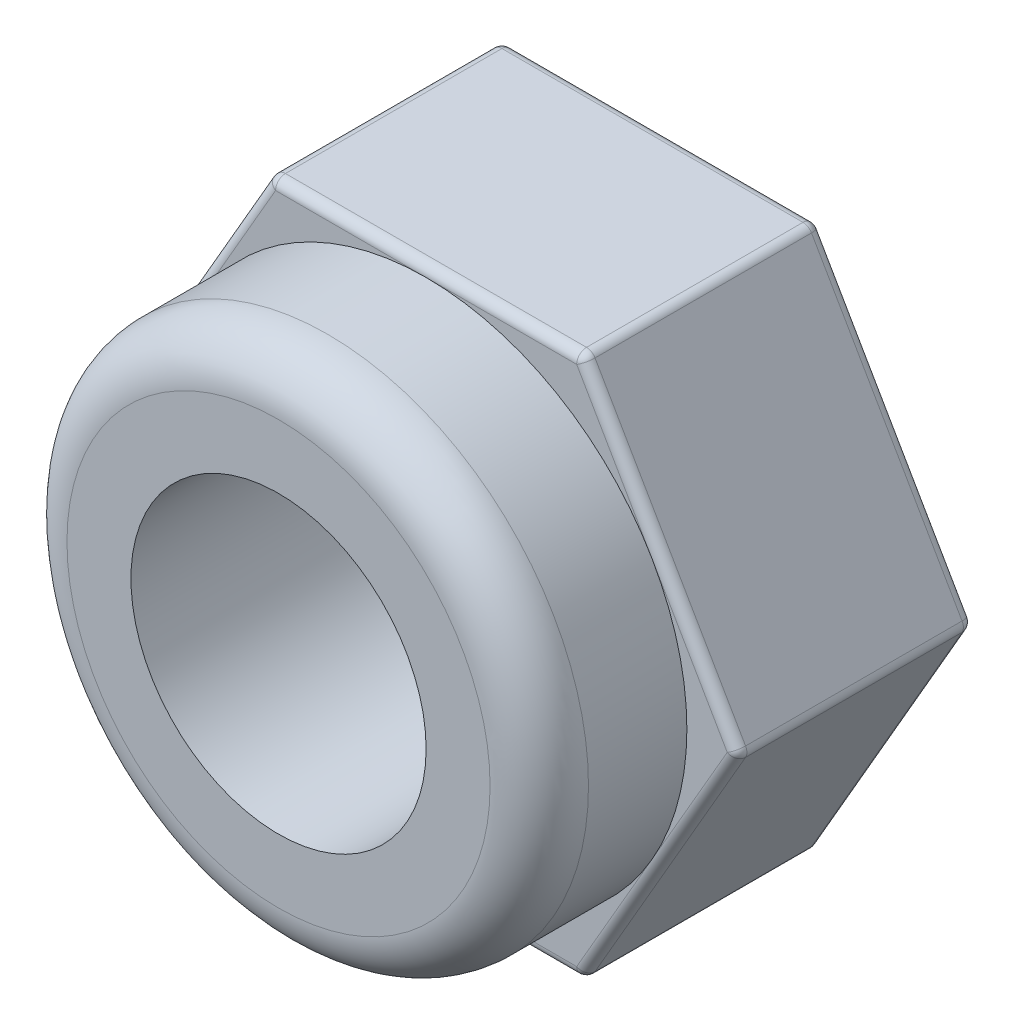
ISO-10303-21;
HEADER;
FILE_DESCRIPTION(('STEP AP214'),'2;1');
FILE_NAME('part.step','',(''),(''),'','','');
FILE_SCHEMA(('AUTOMOTIVE_DESIGN { 1 0 10303 214 1 1 1 1 }'));
ENDSEC;
DATA;
#1=APPLICATION_CONTEXT('core data for automotive mechanical design processes');
#2=APPLICATION_PROTOCOL_DEFINITION('international standard','automotive_design',2000,#1);
#3=PRODUCT_CONTEXT('',#1,'mechanical');
#4=PRODUCT('Part','Part','',(#3));
#5=PRODUCT_RELATED_PRODUCT_CATEGORY('part','',(#4));
#6=PRODUCT_DEFINITION_FORMATION('','',#4);
#7=PRODUCT_DEFINITION_CONTEXT('part definition',#1,'design');
#8=PRODUCT_DEFINITION('design','',#6,#7);
#9=PRODUCT_DEFINITION_SHAPE('','',#8);
#10=(LENGTH_UNIT() NAMED_UNIT(*) SI_UNIT(.MILLI.,.METRE.));
#11=(NAMED_UNIT(*) PLANE_ANGLE_UNIT() SI_UNIT($,.RADIAN.));
#12=(NAMED_UNIT(*) SI_UNIT($,.STERADIAN.) SOLID_ANGLE_UNIT());
#13=UNCERTAINTY_MEASURE_WITH_UNIT(LENGTH_MEASURE(1.E-05),#10,'distance_accuracy_value','');
#14=(GEOMETRIC_REPRESENTATION_CONTEXT(3) GLOBAL_UNCERTAINTY_ASSIGNED_CONTEXT((#13)) GLOBAL_UNIT_ASSIGNED_CONTEXT((#10,
#11,#12)) REPRESENTATION_CONTEXT('',''));
#15=CARTESIAN_POINT('',(0.,0.,0.));
#16=DIRECTION('',(0.,0.,1.));
#17=DIRECTION('',(1.,0.,0.));
#18=AXIS2_PLACEMENT_3D('',#15,#16,#17);
#19=CARTESIAN_POINT('',(0.,0.,2.4));
#20=DIRECTION('',(0.,0.,1.));
#21=DIRECTION('',(1.,0.,0.));
#22=AXIS2_PLACEMENT_3D('',#19,#20,#21);
#23=PLANE('',#22);
#24=DIRECTION('',(0.5,-0.866025403784439,0.));
#25=VECTOR('',#24,1.);
#26=CARTESIAN_POINT('',(-1.50111069989303,-2.7,2.4));
#27=LINE('',#26,#25);
#28=CARTESIAN_POINT('',(-2.29496732002876,-1.325,2.4));
#29=VERTEX_POINT('',#28);
#30=CARTESIAN_POINT('',(-1.52997821335251,-2.65,2.4));
#31=VERTEX_POINT('',#30);
#32=EDGE_CURVE('E189',#29,#31,#27,.T.);
#33=ORIENTED_EDGE('',*,*,#32,.T.);
#34=DIRECTION('',(1.,0.,0.));
#35=VECTOR('',#34,1.);
#36=CARTESIAN_POINT('',(1.58771324027147,-2.65,2.4));
#37=LINE('',#36,#35);
#38=CARTESIAN_POINT('',(0.,-2.65,2.4));
#39=VERTEX_POINT('',#38);
#40=EDGE_CURVE('E224',#31,#39,#37,.T.);
#41=ORIENTED_EDGE('',*,*,#40,.T.);
#42=CARTESIAN_POINT('',(0.,0.,2.4));
#43=DIRECTION('',(0.,0.,1.));
#44=DIRECTION('',(1.,0.,0.));
#45=AXIS2_PLACEMENT_3D('',#42,#43,#44);
#46=CIRCLE('',#45,2.65);
#47=EDGE_CURVE('E209',#39,#29,#46,.F.);
#48=ORIENTED_EDGE('',*,*,#47,.T.);
#49=EDGE_LOOP('',(#33,#41,#48));
#50=FACE_BOUND('',#49,.T.);
#51=ADVANCED_FACE('F36',(#50),#23,.T.);
#52=CARTESIAN_POINT('',(2.29496732002876,-1.325,2.4));
#53=VERTEX_POINT('',#52);
#54=EDGE_CURVE('E183',#53,#39,#46,.F.);
#55=ORIENTED_EDGE('',*,*,#54,.T.);
#56=DIRECTION('',(1.,0.,0.));
#57=VECTOR('',#56,1.);
#58=CARTESIAN_POINT('',(1.58771324027147,-2.65,2.4));
#59=LINE('',#58,#57);
#60=CARTESIAN_POINT('',(1.52997821335251,-2.65,2.4));
#61=VERTEX_POINT('',#60);
#62=EDGE_CURVE('E185',#39,#61,#59,.T.);
#63=ORIENTED_EDGE('',*,*,#62,.T.);
#64=DIRECTION('',(0.5,0.866025403784439,0.));
#65=VECTOR('',#64,1.);
#66=CARTESIAN_POINT('',(3.0888239401645,0.0500000000000003,2.4));
#67=LINE('',#66,#65);
#68=EDGE_CURVE('E179',#61,#53,#67,.T.);
#69=ORIENTED_EDGE('',*,*,#68,.T.);
#70=EDGE_LOOP('',(#55,#63,#69));
#71=FACE_BOUND('',#70,.T.);
#72=ADVANCED_FACE('F181',(#71),#23,.T.);
#73=CARTESIAN_POINT('',(2.29496732002876,1.325,2.4));
#74=VERTEX_POINT('',#73);
#75=EDGE_CURVE('E195',#74,#53,#46,.F.);
#76=ORIENTED_EDGE('',*,*,#75,.T.);
#77=DIRECTION('',(0.5,0.866025403784439,0.));
#78=VECTOR('',#77,1.);
#79=CARTESIAN_POINT('',(3.0888239401645,0.0500000000000003,2.4));
#80=LINE('',#79,#78);
#81=CARTESIAN_POINT('',(3.05995642670502,0.,2.4));
#82=VERTEX_POINT('',#81);
#83=EDGE_CURVE('E190',#53,#82,#80,.T.);
#84=ORIENTED_EDGE('',*,*,#83,.T.);
#85=DIRECTION('',(-0.5,0.866025403784439,0.));
#86=VECTOR('',#85,1.);
#87=CARTESIAN_POINT('',(1.50111069989303,2.7,2.4));
#88=LINE('',#87,#86);
#89=EDGE_CURVE('E199',#82,#74,#88,.T.);
#90=ORIENTED_EDGE('',*,*,#89,.T.);
#91=EDGE_LOOP('',(#76,#84,#90));
#92=FACE_BOUND('',#91,.T.);
#93=ADVANCED_FACE('F196',(#92),#23,.T.);
#94=DIRECTION('',(-0.5,-0.866025403784439,0.));
#95=VECTOR('',#94,1.);
#96=CARTESIAN_POINT('',(-3.0888239401645,-0.0499999999999999,2.4));
#97=LINE('',#96,#95);
#98=CARTESIAN_POINT('',(-2.29496732002876,1.325,2.4));
#99=VERTEX_POINT('',#98);
#100=CARTESIAN_POINT('',(-3.05995642670502,0.,2.4));
#101=VERTEX_POINT('',#100);
#102=EDGE_CURVE('E218',#99,#101,#97,.T.);
#103=ORIENTED_EDGE('',*,*,#102,.T.);
#104=DIRECTION('',(0.5,-0.866025403784439,0.));
#105=VECTOR('',#104,1.);
#106=CARTESIAN_POINT('',(-1.50111069989303,-2.7,2.4));
#107=LINE('',#106,#105);
#108=EDGE_CURVE('E216',#101,#29,#107,.T.);
#109=ORIENTED_EDGE('',*,*,#108,.T.);
#110=EDGE_CURVE('E506',#29,#99,#46,.F.);
#111=ORIENTED_EDGE('',*,*,#110,.T.);
#112=EDGE_LOOP('',(#103,#109,#111));
#113=FACE_BOUND('',#112,.T.);
#114=ADVANCED_FACE('F490',(#113),#23,.T.);
#115=CARTESIAN_POINT('',(0.,2.65,2.4));
#116=VERTEX_POINT('',#115);
#117=EDGE_CURVE('E203',#116,#74,#46,.F.);
#118=ORIENTED_EDGE('',*,*,#117,.T.);
#119=DIRECTION('',(-0.5,0.866025403784439,0.));
#120=VECTOR('',#119,1.);
#121=CARTESIAN_POINT('',(1.50111069989303,2.7,2.4));
#122=LINE('',#121,#120);
#123=CARTESIAN_POINT('',(1.52997821335251,2.65,2.4));
#124=VERTEX_POINT('',#123);
#125=EDGE_CURVE('E500',#74,#124,#122,.T.);
#126=ORIENTED_EDGE('',*,*,#125,.T.);
#127=DIRECTION('',(-1.,0.,0.));
#128=VECTOR('',#127,1.);
#129=CARTESIAN_POINT('',(-1.58771324027147,2.65,2.4));
#130=LINE('',#129,#128);
#131=EDGE_CURVE('E502',#124,#116,#130,.T.);
#132=ORIENTED_EDGE('',*,*,#131,.T.);
#133=EDGE_LOOP('',(#118,#126,#132));
#134=FACE_BOUND('',#133,.T.);
#135=ADVANCED_FACE('F481',(#134),#23,.T.);
#136=CARTESIAN_POINT('',(1.58771324027147,-2.75,2.4));
#137=DIRECTION('',(-0.866025403784439,0.5,0.));
#138=DIRECTION('',(-0.5,-0.866025403784439,0.));
#139=AXIS2_PLACEMENT_3D('',#136,#137,#138);
#140=PLANE('',#139);
#141=DIRECTION('',(0.,0.,-1.));
#142=VECTOR('',#141,1.);
#143=CARTESIAN_POINT('',(3.14655896708346,-0.0499999999999997,2.4));
#144=LINE('',#143,#142);
#145=CARTESIAN_POINT('',(3.14655896708346,-0.0499999999999997,0.0999999999999998));
#146=VERTEX_POINT('',#145);
#147=CARTESIAN_POINT('',(3.14655896708346,-0.0499999999999997,2.3));
#148=VERTEX_POINT('',#147);
#149=EDGE_CURVE('E252',#146,#148,#144,.F.);
#150=ORIENTED_EDGE('',*,*,#149,.T.);
#151=DIRECTION('',(0.5,0.866025403784439,0.));
#152=VECTOR('',#151,1.);
#153=CARTESIAN_POINT('',(1.58771324027147,-2.75,2.3));
#154=LINE('',#153,#152);
#155=CARTESIAN_POINT('',(1.61658075373095,-2.7,2.3));
#156=VERTEX_POINT('',#155);
#157=EDGE_CURVE('E254',#148,#156,#154,.F.);
#158=ORIENTED_EDGE('',*,*,#157,.T.);
#159=DIRECTION('',(0.,0.,-1.));
#160=VECTOR('',#159,1.);
#161=CARTESIAN_POINT('',(1.61658075373095,-2.7,2.4));
#162=LINE('',#161,#160);
#163=CARTESIAN_POINT('',(1.61658075373095,-2.7,0.0999999999999998));
#164=VERTEX_POINT('',#163);
#165=EDGE_CURVE('E248',#156,#164,#162,.T.);
#166=ORIENTED_EDGE('',*,*,#165,.T.);
#167=DIRECTION('',(0.5,0.866025403784439,0.));
#168=VECTOR('',#167,1.);
#169=CARTESIAN_POINT('',(1.58771324027147,-2.75,0.0999999999999998));
#170=LINE('',#169,#168);
#171=EDGE_CURVE('E250',#164,#146,#170,.T.);
#172=ORIENTED_EDGE('',*,*,#171,.T.);
#173=EDGE_LOOP('',(#150,#158,#166,#172));
#174=FACE_BOUND('',#173,.T.);
#175=ADVANCED_FACE('F489',(#174),#140,.F.);
#176=CARTESIAN_POINT('',(3.17542648054294,0.,2.4));
#177=DIRECTION('',(-0.866025403784439,-0.5,0.));
#178=DIRECTION('',(0.5,-0.866025403784439,0.));
#179=AXIS2_PLACEMENT_3D('',#176,#177,#178);
#180=PLANE('',#179);
#181=DIRECTION('',(-0.5,0.866025403784439,0.));
#182=VECTOR('',#181,1.);
#183=CARTESIAN_POINT('',(3.17542648054294,0.,2.3));
#184=LINE('',#183,#182);
#185=CARTESIAN_POINT('',(1.61658075373095,2.7,2.3));
#186=VERTEX_POINT('',#185);
#187=CARTESIAN_POINT('',(3.14655896708346,0.0500000000000004,2.3));
#188=VERTEX_POINT('',#187);
#189=EDGE_CURVE('E230',#186,#188,#184,.F.);
#190=ORIENTED_EDGE('',*,*,#189,.T.);
#191=DIRECTION('',(0.,0.,-1.));
#192=VECTOR('',#191,1.);
#193=CARTESIAN_POINT('',(3.14655896708346,0.0500000000000004,2.4));
#194=LINE('',#193,#192);
#195=CARTESIAN_POINT('',(3.14655896708346,0.0500000000000004,0.0999999999999998));
#196=VERTEX_POINT('',#195);
#197=EDGE_CURVE('E233',#188,#196,#194,.T.);
#198=ORIENTED_EDGE('',*,*,#197,.T.);
#199=DIRECTION('',(-0.5,0.866025403784439,0.));
#200=VECTOR('',#199,1.);
#201=CARTESIAN_POINT('',(3.17542648054294,0.,0.0999999999999998));
#202=LINE('',#201,#200);
#203=CARTESIAN_POINT('',(1.61658075373095,2.7,0.0999999999999998));
#204=VERTEX_POINT('',#203);
#205=EDGE_CURVE('E228',#196,#204,#202,.T.);
#206=ORIENTED_EDGE('',*,*,#205,.T.);
#207=DIRECTION('',(0.,0.,-1.));
#208=VECTOR('',#207,1.);
#209=CARTESIAN_POINT('',(1.61658075373095,2.7,2.4));
#210=LINE('',#209,#208);
#211=EDGE_CURVE('E226',#204,#186,#210,.F.);
#212=ORIENTED_EDGE('',*,*,#211,.T.);
#213=EDGE_LOOP('',(#190,#198,#206,#212));
#214=FACE_BOUND('',#213,.T.);
#215=ADVANCED_FACE('F496',(#214),#180,.F.);
#216=CARTESIAN_POINT('',(1.58771324027147,2.75,2.4));
#217=DIRECTION('',(0.,-1.,0.));
#218=DIRECTION('',(0.,0.,-1.));
#219=AXIS2_PLACEMENT_3D('',#216,#217,#218);
#220=PLANE('',#219);
#221=DIRECTION('',(-1.,0.,0.));
#222=VECTOR('',#221,1.);
#223=CARTESIAN_POINT('',(1.58771324027147,2.75,2.3));
#224=LINE('',#223,#222);
#225=CARTESIAN_POINT('',(-1.52997821335251,2.75,2.3));
#226=VERTEX_POINT('',#225);
#227=CARTESIAN_POINT('',(1.52997821335251,2.75,2.3));
#228=VERTEX_POINT('',#227);
#229=EDGE_CURVE('E45',#226,#228,#224,.F.);
#230=ORIENTED_EDGE('',*,*,#229,.T.);
#231=DIRECTION('',(0.,0.,-1.));
#232=VECTOR('',#231,1.);
#233=CARTESIAN_POINT('',(1.52997821335251,2.75,2.4));
#234=LINE('',#233,#232);
#235=CARTESIAN_POINT('',(1.52997821335251,2.75,0.0999999999999998));
#236=VERTEX_POINT('',#235);
#237=EDGE_CURVE('E11',#228,#236,#234,.T.);
#238=ORIENTED_EDGE('',*,*,#237,.T.);
#239=DIRECTION('',(-1.,0.,0.));
#240=VECTOR('',#239,1.);
#241=CARTESIAN_POINT('',(1.58771324027147,2.75,0.0999999999999998));
#242=LINE('',#241,#240);
#243=CARTESIAN_POINT('',(-1.52997821335251,2.75,0.0999999999999998));
#244=VERTEX_POINT('',#243);
#245=EDGE_CURVE('E284',#236,#244,#242,.T.);
#246=ORIENTED_EDGE('',*,*,#245,.T.);
#247=DIRECTION('',(0.,0.,-1.));
#248=VECTOR('',#247,1.);
#249=CARTESIAN_POINT('',(-1.52997821335251,2.75,2.4));
#250=LINE('',#249,#248);
#251=EDGE_CURVE('E56',#244,#226,#250,.F.);
#252=ORIENTED_EDGE('',*,*,#251,.T.);
#253=EDGE_LOOP('',(#230,#238,#246,#252));
#254=FACE_BOUND('',#253,.T.);
#255=ADVANCED_FACE('F567',(#254),#220,.F.);
#256=CARTESIAN_POINT('',(-1.58771324027147,2.75,2.4));
#257=DIRECTION('',(0.866025403784439,-0.5,0.));
#258=DIRECTION('',(0.5,0.866025403784439,0.));
#259=AXIS2_PLACEMENT_3D('',#256,#257,#258);
#260=PLANE('',#259);
#261=DIRECTION('',(0.,0.,-1.));
#262=VECTOR('',#261,1.);
#263=CARTESIAN_POINT('',(-3.14655896708346,0.0499999999999993,2.4));
#264=LINE('',#263,#262);
#265=CARTESIAN_POINT('',(-3.14655896708346,0.0499999999999998,0.0999999999999998));
#266=VERTEX_POINT('',#265);
#267=CARTESIAN_POINT('',(-3.14655896708346,0.0499999999999998,2.3));
#268=VERTEX_POINT('',#267);
#269=EDGE_CURVE('E279',#266,#268,#264,.F.);
#270=ORIENTED_EDGE('',*,*,#269,.T.);
#271=DIRECTION('',(-0.5,-0.866025403784439,0.));
#272=VECTOR('',#271,1.);
#273=CARTESIAN_POINT('',(-1.58771324027147,2.75,2.3));
#274=LINE('',#273,#272);
#275=CARTESIAN_POINT('',(-1.61658075373095,2.7,2.3));
#276=VERTEX_POINT('',#275);
#277=EDGE_CURVE('E281',#268,#276,#274,.F.);
#278=ORIENTED_EDGE('',*,*,#277,.T.);
#279=DIRECTION('',(0.,0.,-1.));
#280=VECTOR('',#279,1.);
#281=CARTESIAN_POINT('',(-1.61658075373095,2.7,2.4));
#282=LINE('',#281,#280);
#283=CARTESIAN_POINT('',(-1.61658075373095,2.7,0.0999999999999998));
#284=VERTEX_POINT('',#283);
#285=EDGE_CURVE('E275',#276,#284,#282,.T.);
#286=ORIENTED_EDGE('',*,*,#285,.T.);
#287=DIRECTION('',(-0.5,-0.866025403784439,0.));
#288=VECTOR('',#287,1.);
#289=CARTESIAN_POINT('',(-1.58771324027147,2.75,0.0999999999999998));
#290=LINE('',#289,#288);
#291=EDGE_CURVE('E277',#284,#266,#290,.T.);
#292=ORIENTED_EDGE('',*,*,#291,.T.);
#293=EDGE_LOOP('',(#270,#278,#286,#292));
#294=FACE_BOUND('',#293,.T.);
#295=ADVANCED_FACE('F531',(#294),#260,.F.);
#296=CARTESIAN_POINT('',(-3.17542648054294,0.,2.4));
#297=DIRECTION('',(0.866025403784439,0.5,0.));
#298=DIRECTION('',(-0.5,0.866025403784439,0.));
#299=AXIS2_PLACEMENT_3D('',#296,#297,#298);
#300=PLANE('',#299);
#301=DIRECTION('',(0.,0.,-1.));
#302=VECTOR('',#301,1.);
#303=CARTESIAN_POINT('',(-1.61658075373095,-2.7,2.4));
#304=LINE('',#303,#302);
#305=CARTESIAN_POINT('',(-1.61658075373095,-2.7,0.0999999999999998));
#306=VERTEX_POINT('',#305);
#307=CARTESIAN_POINT('',(-1.61658075373095,-2.7,2.3));
#308=VERTEX_POINT('',#307);
#309=EDGE_CURVE('E270',#306,#308,#304,.F.);
#310=ORIENTED_EDGE('',*,*,#309,.T.);
#311=DIRECTION('',(0.5,-0.866025403784439,0.));
#312=VECTOR('',#311,1.);
#313=CARTESIAN_POINT('',(-3.17542648054294,0.,2.3));
#314=LINE('',#313,#312);
#315=CARTESIAN_POINT('',(-3.14655896708346,-0.0500000000000002,2.3));
#316=VERTEX_POINT('',#315);
#317=EDGE_CURVE('E272',#308,#316,#314,.F.);
#318=ORIENTED_EDGE('',*,*,#317,.T.);
#319=DIRECTION('',(0.,0.,-1.));
#320=VECTOR('',#319,1.);
#321=CARTESIAN_POINT('',(-3.14655896708346,-0.0500000000000002,2.4));
#322=LINE('',#321,#320);
#323=CARTESIAN_POINT('',(-3.14655896708346,-0.0500000000000002,0.0999999999999998));
#324=VERTEX_POINT('',#323);
#325=EDGE_CURVE('E266',#316,#324,#322,.T.);
#326=ORIENTED_EDGE('',*,*,#325,.T.);
#327=DIRECTION('',(0.5,-0.866025403784439,0.));
#328=VECTOR('',#327,1.);
#329=CARTESIAN_POINT('',(-3.17542648054294,0.,0.0999999999999998));
#330=LINE('',#329,#328);
#331=EDGE_CURVE('E268',#324,#306,#330,.T.);
#332=ORIENTED_EDGE('',*,*,#331,.T.);
#333=EDGE_LOOP('',(#310,#318,#326,#332));
#334=FACE_BOUND('',#333,.T.);
#335=ADVANCED_FACE('F413',(#334),#300,.F.);
#336=CARTESIAN_POINT('',(-1.58771324027147,-2.75,2.4));
#337=DIRECTION('',(0.,1.,0.));
#338=DIRECTION('',(0.,0.,1.));
#339=AXIS2_PLACEMENT_3D('',#336,#337,#338);
#340=PLANE('',#339);
#341=DIRECTION('',(0.,0.,-1.));
#342=VECTOR('',#341,1.);
#343=CARTESIAN_POINT('',(1.52997821335251,-2.75,2.4));
#344=LINE('',#343,#342);
#345=CARTESIAN_POINT('',(1.52997821335251,-2.75,0.0999999999999998));
#346=VERTEX_POINT('',#345);
#347=CARTESIAN_POINT('',(1.52997821335251,-2.75,2.3));
#348=VERTEX_POINT('',#347);
#349=EDGE_CURVE('E261',#346,#348,#344,.F.);
#350=ORIENTED_EDGE('',*,*,#349,.T.);
#351=DIRECTION('',(1.,0.,0.));
#352=VECTOR('',#351,1.);
#353=CARTESIAN_POINT('',(-1.58771324027147,-2.75,2.3));
#354=LINE('',#353,#352);
#355=CARTESIAN_POINT('',(-1.52997821335251,-2.75,2.3));
#356=VERTEX_POINT('',#355);
#357=EDGE_CURVE('E263',#348,#356,#354,.F.);
#358=ORIENTED_EDGE('',*,*,#357,.T.);
#359=DIRECTION('',(0.,0.,-1.));
#360=VECTOR('',#359,1.);
#361=CARTESIAN_POINT('',(-1.52997821335251,-2.75,2.4));
#362=LINE('',#361,#360);
#363=CARTESIAN_POINT('',(-1.52997821335251,-2.75,0.0999999999999998));
#364=VERTEX_POINT('',#363);
#365=EDGE_CURVE('E257',#356,#364,#362,.T.);
#366=ORIENTED_EDGE('',*,*,#365,.T.);
#367=DIRECTION('',(1.,0.,0.));
#368=VECTOR('',#367,1.);
#369=CARTESIAN_POINT('',(-1.58771324027147,-2.75,0.0999999999999998));
#370=LINE('',#369,#368);
#371=EDGE_CURVE('E259',#364,#346,#370,.T.);
#372=ORIENTED_EDGE('',*,*,#371,.T.);
#373=EDGE_LOOP('',(#350,#358,#366,#372));
#374=FACE_BOUND('',#373,.T.);
#375=ADVANCED_FACE('F404',(#374),#340,.F.);
#376=DIRECTION('',(-1.,0.,0.));
#377=VECTOR('',#376,1.);
#378=CARTESIAN_POINT('',(-1.58771324027147,2.65,2.4));
#379=LINE('',#378,#377);
#380=CARTESIAN_POINT('',(-1.52997821335251,2.65,2.4));
#381=VERTEX_POINT('',#380);
#382=EDGE_CURVE('E516',#116,#381,#379,.T.);
#383=ORIENTED_EDGE('',*,*,#382,.T.);
#384=DIRECTION('',(-0.5,-0.866025403784439,0.));
#385=VECTOR('',#384,1.);
#386=CARTESIAN_POINT('',(-3.0888239401645,-0.0499999999999999,2.4));
#387=LINE('',#386,#385);
#388=EDGE_CURVE('E519',#381,#99,#387,.T.);
#389=ORIENTED_EDGE('',*,*,#388,.T.);
#390=EDGE_CURVE('E505',#99,#116,#46,.F.);
#391=ORIENTED_EDGE('',*,*,#390,.T.);
#392=EDGE_LOOP('',(#383,#389,#391));
#393=FACE_BOUND('',#392,.T.);
#394=ADVANCED_FACE('F473',(#393),#23,.T.);
#395=CARTESIAN_POINT('',(0.,0.,0.));
#396=DIRECTION('',(0.,0.,1.));
#397=DIRECTION('',(1.,0.,0.));
#398=AXIS2_PLACEMENT_3D('',#395,#396,#397);
#399=PLANE('',#398);
#400=CARTESIAN_POINT('',(0.,0.,0.));
#401=DIRECTION('',(0.,0.,1.));
#402=DIRECTION('',(1.,0.,0.));
#403=AXIS2_PLACEMENT_3D('',#400,#401,#402);
#404=CIRCLE('',#403,1.5);
#405=CARTESIAN_POINT('',(1.5,0.,0.));
#406=VERTEX_POINT('',#405);
#407=EDGE_CURVE('E292',#406,#406,#404,.T.);
#408=ORIENTED_EDGE('',*,*,#407,.T.);
#409=EDGE_LOOP('',(#408));
#410=FACE_BOUND('',#409,.T.);
#411=DIRECTION('',(-1.,0.,0.));
#412=VECTOR('',#411,1.);
#413=CARTESIAN_POINT('',(0.,2.65,0.));
#414=LINE('',#413,#412);
#415=CARTESIAN_POINT('',(-1.52997821335251,2.65,0.));
#416=VERTEX_POINT('',#415);
#417=CARTESIAN_POINT('',(1.52997821335251,2.65,0.));
#418=VERTEX_POINT('',#417);
#419=EDGE_CURVE('E235',#416,#418,#414,.F.);
#420=ORIENTED_EDGE('',*,*,#419,.T.);
#421=DIRECTION('',(-0.5,0.866025403784439,0.));
#422=VECTOR('',#421,1.);
#423=CARTESIAN_POINT('',(2.29496732002876,1.325,0.));
#424=LINE('',#423,#422);
#425=CARTESIAN_POINT('',(3.05995642670502,0.,0.));
#426=VERTEX_POINT('',#425);
#427=EDGE_CURVE('E245',#418,#426,#424,.F.);
#428=ORIENTED_EDGE('',*,*,#427,.T.);
#429=DIRECTION('',(0.5,0.866025403784439,0.));
#430=VECTOR('',#429,1.);
#431=CARTESIAN_POINT('',(2.29496732002876,-1.325,0.));
#432=LINE('',#431,#430);
#433=CARTESIAN_POINT('',(1.52997821335251,-2.65,0.));
#434=VERTEX_POINT('',#433);
#435=EDGE_CURVE('E243',#426,#434,#432,.F.);
#436=ORIENTED_EDGE('',*,*,#435,.T.);
#437=DIRECTION('',(1.,0.,0.));
#438=VECTOR('',#437,1.);
#439=CARTESIAN_POINT('',(0.,-2.65,0.));
#440=LINE('',#439,#438);
#441=CARTESIAN_POINT('',(-1.52997821335251,-2.65,0.));
#442=VERTEX_POINT('',#441);
#443=EDGE_CURVE('E241',#434,#442,#440,.F.);
#444=ORIENTED_EDGE('',*,*,#443,.T.);
#445=DIRECTION('',(0.5,-0.866025403784439,0.));
#446=VECTOR('',#445,1.);
#447=CARTESIAN_POINT('',(-2.29496732002876,-1.325,0.));
#448=LINE('',#447,#446);
#449=CARTESIAN_POINT('',(-3.05995642670502,0.,0.));
#450=VERTEX_POINT('',#449);
#451=EDGE_CURVE('E239',#442,#450,#448,.F.);
#452=ORIENTED_EDGE('',*,*,#451,.T.);
#453=DIRECTION('',(-0.5,-0.866025403784439,0.));
#454=VECTOR('',#453,1.);
#455=CARTESIAN_POINT('',(-2.29496732002876,1.325,0.));
#456=LINE('',#455,#454);
#457=EDGE_CURVE('E237',#450,#416,#456,.F.);
#458=ORIENTED_EDGE('',*,*,#457,.T.);
#459=EDGE_LOOP('',(#420,#428,#436,#444,#452,#458));
#460=FACE_BOUND('',#459,.T.);
#461=ADVANCED_FACE('F436',(#410,#460),#399,.F.);
#462=CARTESIAN_POINT('',(0.,0.,3.9));
#463=DIRECTION('',(0.,0.,-1.));
#464=DIRECTION('',(-1.,0.,0.));
#465=AXIS2_PLACEMENT_3D('',#462,#463,#464);
#466=CYLINDRICAL_SURFACE('',#465,2.65);
#467=CARTESIAN_POINT('',(0.,0.,3.4));
#468=DIRECTION('',(0.,0.,1.));
#469=DIRECTION('',(1.,0.,0.));
#470=AXIS2_PLACEMENT_3D('',#467,#468,#469);
#471=CIRCLE('',#470,2.65);
#472=CARTESIAN_POINT('',(2.65,0.,3.4));
#473=VERTEX_POINT('',#472);
#474=EDGE_CURVE('E513',#473,#473,#471,.F.);
#475=ORIENTED_EDGE('',*,*,#474,.T.);
#476=EDGE_LOOP('',(#475));
#477=FACE_BOUND('',#476,.T.);
#478=ORIENTED_EDGE('',*,*,#54,.F.);
#479=ORIENTED_EDGE('',*,*,#75,.F.);
#480=ORIENTED_EDGE('',*,*,#117,.F.);
#481=ORIENTED_EDGE('',*,*,#390,.F.);
#482=ORIENTED_EDGE('',*,*,#110,.F.);
#483=ORIENTED_EDGE('',*,*,#47,.F.);
#484=EDGE_LOOP('',(#478,#479,#480,#481,#482,#483));
#485=FACE_BOUND('',#484,.T.);
#486=ADVANCED_FACE('F206',(#477,#485),#466,.T.);
#487=CARTESIAN_POINT('',(0.,0.,3.9));
#488=DIRECTION('',(0.,0.,1.));
#489=DIRECTION('',(1.,0.,0.));
#490=AXIS2_PLACEMENT_3D('',#487,#488,#489);
#491=PLANE('',#490);
#492=CARTESIAN_POINT('',(0.,0.,3.9));
#493=DIRECTION('',(0.,0.,1.));
#494=DIRECTION('',(1.,0.,0.));
#495=AXIS2_PLACEMENT_3D('',#492,#493,#494);
#496=CIRCLE('',#495,1.5);
#497=CARTESIAN_POINT('',(1.5,0.,3.9));
#498=VERTEX_POINT('',#497);
#499=EDGE_CURVE('E509',#498,#498,#496,.T.);
#500=ORIENTED_EDGE('',*,*,#499,.F.);
#501=EDGE_LOOP('',(#500));
#502=FACE_BOUND('',#501,.T.);
#503=CARTESIAN_POINT('',(0.,0.,3.9));
#504=DIRECTION('',(0.,0.,1.));
#505=DIRECTION('',(1.,0.,0.));
#506=AXIS2_PLACEMENT_3D('',#503,#504,#505);
#507=CIRCLE('',#506,2.15);
#508=CARTESIAN_POINT('',(2.15,0.,3.9));
#509=VERTEX_POINT('',#508);
#510=EDGE_CURVE('E210',#509,#509,#507,.T.);
#511=ORIENTED_EDGE('',*,*,#510,.T.);
#512=EDGE_LOOP('',(#511));
#513=FACE_BOUND('',#512,.T.);
#514=ADVANCED_FACE('F581',(#502,#513),#491,.T.);
#515=CARTESIAN_POINT('',(0.,0.,3.4));
#516=DIRECTION('',(0.,0.,1.));
#517=DIRECTION('',(1.,0.,0.));
#518=AXIS2_PLACEMENT_3D('',#515,#516,#517);
#519=TOROIDAL_SURFACE('',#518,2.15,0.5);
#520=ORIENTED_EDGE('',*,*,#474,.F.);
#521=EDGE_LOOP('',(#520));
#522=FACE_BOUND('',#521,.T.);
#523=ORIENTED_EDGE('',*,*,#510,.F.);
#524=EDGE_LOOP('',(#523));
#525=FACE_BOUND('',#524,.T.);
#526=ADVANCED_FACE('F578',(#522,#525),#519,.T.);
#527=CARTESIAN_POINT('',(-3.0888239401645,0.0499999999999999,0.0999999999999998));
#528=DIRECTION('',(0.5,-0.866025403784439,0.));
#529=DIRECTION('',(0.866025403784439,0.5,0.));
#530=AXIS2_PLACEMENT_3D('',#527,#528,#529);
#531=CYLINDRICAL_SURFACE('',#530,0.1);
#532=CARTESIAN_POINT('',(-1.52997821335251,-2.65,0.0999999999999998));
#533=DIRECTION('',(0.500000000000001,-0.866025403784438,0.));
#534=DIRECTION('',(0.866025403784438,0.500000000000001,0.));
#535=AXIS2_PLACEMENT_3D('',#532,#533,#534);
#536=CIRCLE('',#535,0.1);
#537=EDGE_CURVE('E40',#306,#442,#536,.T.);
#538=ORIENTED_EDGE('',*,*,#537,.F.);
#539=ORIENTED_EDGE('',*,*,#331,.F.);
#540=CARTESIAN_POINT('',(-3.05995642670502,0.,0.1));
#541=DIRECTION('',(-0.5,0.866025403784438,0.));
#542=DIRECTION('',(-0.866025403784439,-0.5,0.));
#543=AXIS2_PLACEMENT_3D('',#540,#541,#542);
#544=CIRCLE('',#543,0.1);
#545=EDGE_CURVE('E381',#450,#324,#544,.T.);
#546=ORIENTED_EDGE('',*,*,#545,.F.);
#547=ORIENTED_EDGE('',*,*,#451,.F.);
#548=EDGE_LOOP('',(#538,#539,#546,#547));
#549=FACE_BOUND('',#548,.T.);
#550=ADVANCED_FACE('F38',(#549),#531,.T.);
#551=CARTESIAN_POINT('',(-1.52997821335251,-2.65,0.1));
#552=DIRECTION('',(0.,0.,1.));
#553=DIRECTION('',(1.,0.,0.));
#554=AXIS2_PLACEMENT_3D('',#551,#552,#553);
#555=SPHERICAL_SURFACE('',#554,0.1);
#556=CARTESIAN_POINT('',(-1.52997821335251,-2.65,0.0999999999999998));
#557=DIRECTION('',(0.,0.,-1.));
#558=DIRECTION('',(-1.,0.,0.));
#559=AXIS2_PLACEMENT_3D('',#556,#557,#558);
#560=CIRCLE('',#559,0.1);
#561=EDGE_CURVE('E376',#306,#364,#560,.F.);
#562=ORIENTED_EDGE('',*,*,#561,.F.);
#563=ORIENTED_EDGE('',*,*,#537,.T.);
#564=CARTESIAN_POINT('',(-1.52997821335251,-2.65,0.1));
#565=DIRECTION('',(-1.,0.,0.));
#566=DIRECTION('',(0.,-1.,0.));
#567=AXIS2_PLACEMENT_3D('',#564,#565,#566);
#568=CIRCLE('',#567,0.1);
#569=EDGE_CURVE('E379',#364,#442,#568,.F.);
#570=ORIENTED_EDGE('',*,*,#569,.F.);
#571=EDGE_LOOP('',(#562,#563,#570));
#572=FACE_BOUND('',#571,.T.);
#573=ADVANCED_FACE('F392',(#572),#555,.T.);
#574=CARTESIAN_POINT('',(-3.05995642670502,0.,0.1));
#575=DIRECTION('',(0.,0.,1.));
#576=DIRECTION('',(1.,0.,0.));
#577=AXIS2_PLACEMENT_3D('',#574,#575,#576);
#578=SPHERICAL_SURFACE('',#577,0.1);
#579=CARTESIAN_POINT('',(-3.05995642670502,0.,0.0999999999999998));
#580=DIRECTION('',(-0.500000000000001,-0.866025403784438,0.));
#581=DIRECTION('',(0.866025403784438,-0.500000000000001,0.));
#582=AXIS2_PLACEMENT_3D('',#579,#580,#581);
#583=CIRCLE('',#582,0.1);
#584=EDGE_CURVE('E370',#450,#266,#583,.F.);
#585=ORIENTED_EDGE('',*,*,#584,.F.);
#586=ORIENTED_EDGE('',*,*,#545,.T.);
#587=CARTESIAN_POINT('',(-3.05995642670502,0.,0.0999999999999998));
#588=DIRECTION('',(0.,0.,-1.));
#589=DIRECTION('',(-1.,0.,0.));
#590=AXIS2_PLACEMENT_3D('',#587,#588,#589);
#591=CIRCLE('',#590,0.1);
#592=EDGE_CURVE('E373',#266,#324,#591,.F.);
#593=ORIENTED_EDGE('',*,*,#592,.F.);
#594=EDGE_LOOP('',(#585,#586,#593));
#595=FACE_BOUND('',#594,.T.);
#596=ADVANCED_FACE('F429',(#595),#578,.T.);
#597=CARTESIAN_POINT('',(-1.58771324027147,-2.65,0.0999999999999998));
#598=DIRECTION('',(1.,0.,0.));
#599=DIRECTION('',(0.,0.,-1.));
#600=AXIS2_PLACEMENT_3D('',#597,#598,#599);
#601=CYLINDRICAL_SURFACE('',#600,0.1);
#602=ORIENTED_EDGE('',*,*,#569,.T.);
#603=ORIENTED_EDGE('',*,*,#443,.F.);
#604=CARTESIAN_POINT('',(1.52997821335251,-2.65,0.0999999999999998));
#605=DIRECTION('',(1.,0.,0.));
#606=DIRECTION('',(0.,0.,-1.));
#607=AXIS2_PLACEMENT_3D('',#604,#605,#606);
#608=CIRCLE('',#607,0.1);
#609=EDGE_CURVE('E367',#346,#434,#608,.T.);
#610=ORIENTED_EDGE('',*,*,#609,.F.);
#611=ORIENTED_EDGE('',*,*,#371,.F.);
#612=EDGE_LOOP('',(#602,#603,#610,#611));
#613=FACE_BOUND('',#612,.T.);
#614=ADVANCED_FACE('F400',(#613),#601,.T.);
#615=CARTESIAN_POINT('',(-1.52997821335251,-2.65,2.4));
#616=DIRECTION('',(0.,0.,-1.));
#617=DIRECTION('',(-1.,0.,0.));
#618=AXIS2_PLACEMENT_3D('',#615,#616,#617);
#619=CYLINDRICAL_SURFACE('',#618,0.1);
#620=ORIENTED_EDGE('',*,*,#561,.T.);
#621=ORIENTED_EDGE('',*,*,#365,.F.);
#622=CARTESIAN_POINT('',(-1.52997821335251,-2.65,2.3));
#623=DIRECTION('',(0.,0.,1.));
#624=DIRECTION('',(1.,0.,0.));
#625=AXIS2_PLACEMENT_3D('',#622,#623,#624);
#626=CIRCLE('',#625,0.1);
#627=EDGE_CURVE('E364',#308,#356,#626,.T.);
#628=ORIENTED_EDGE('',*,*,#627,.F.);
#629=ORIENTED_EDGE('',*,*,#309,.F.);
#630=EDGE_LOOP('',(#620,#621,#628,#629));
#631=FACE_BOUND('',#630,.T.);
#632=ADVANCED_FACE('F410',(#631),#619,.T.);
#633=CARTESIAN_POINT('',(-2.29496732002876,-1.325,2.3));
#634=DIRECTION('',(-0.5,0.866025403784439,0.));
#635=DIRECTION('',(-0.866025403784439,-0.5,0.));
#636=AXIS2_PLACEMENT_3D('',#633,#634,#635);
#637=CYLINDRICAL_SURFACE('',#636,0.1);
#638=CARTESIAN_POINT('',(-3.05995642670502,0.,2.3));
#639=DIRECTION('',(-0.500000000000001,0.866025403784438,0.));
#640=DIRECTION('',(-0.866025403784438,-0.500000000000001,0.));
#641=AXIS2_PLACEMENT_3D('',#638,#639,#640);
#642=CIRCLE('',#641,0.1);
#643=EDGE_CURVE('E358',#316,#101,#642,.T.);
#644=ORIENTED_EDGE('',*,*,#643,.F.);
#645=ORIENTED_EDGE('',*,*,#317,.F.);
#646=CARTESIAN_POINT('',(-1.52997821335251,-2.65,2.3));
#647=DIRECTION('',(0.500000000000003,-0.866025403784437,0.));
#648=DIRECTION('',(0.866025403784437,0.500000000000003,0.));
#649=AXIS2_PLACEMENT_3D('',#646,#647,#648);
#650=CIRCLE('',#649,0.1);
#651=EDGE_CURVE('E361',#31,#308,#650,.T.);
#652=ORIENTED_EDGE('',*,*,#651,.F.);
#653=ORIENTED_EDGE('',*,*,#32,.F.);
#654=ORIENTED_EDGE('',*,*,#108,.F.);
#655=EDGE_LOOP('',(#644,#645,#652,#653,#654));
#656=FACE_BOUND('',#655,.T.);
#657=ADVANCED_FACE('F417',(#656),#637,.T.);
#658=CARTESIAN_POINT('',(-3.05995642670502,0.,2.4));
#659=DIRECTION('',(0.,0.,-1.));
#660=DIRECTION('',(-1.,0.,0.));
#661=AXIS2_PLACEMENT_3D('',#658,#659,#660);
#662=CYLINDRICAL_SURFACE('',#661,0.1);
#663=ORIENTED_EDGE('',*,*,#592,.T.);
#664=ORIENTED_EDGE('',*,*,#325,.F.);
#665=CARTESIAN_POINT('',(-3.05995642670502,0.,2.3));
#666=DIRECTION('',(0.,0.,1.));
#667=DIRECTION('',(1.,0.,0.));
#668=AXIS2_PLACEMENT_3D('',#665,#666,#667);
#669=CIRCLE('',#668,0.1);
#670=EDGE_CURVE('E356',#268,#316,#669,.T.);
#671=ORIENTED_EDGE('',*,*,#670,.F.);
#672=ORIENTED_EDGE('',*,*,#269,.F.);
#673=EDGE_LOOP('',(#663,#664,#671,#672));
#674=FACE_BOUND('',#673,.T.);
#675=ADVANCED_FACE('F426',(#674),#662,.T.);
#676=CARTESIAN_POINT('',(-1.50111069989303,2.7,0.0999999999999998));
#677=DIRECTION('',(-0.5,-0.866025403784439,0.));
#678=DIRECTION('',(0.866025403784439,-0.5,0.));
#679=AXIS2_PLACEMENT_3D('',#676,#677,#678);
#680=CYLINDRICAL_SURFACE('',#679,0.1);
#681=ORIENTED_EDGE('',*,*,#584,.T.);
#682=ORIENTED_EDGE('',*,*,#291,.F.);
#683=CARTESIAN_POINT('',(-1.52997821335251,2.65,0.1));
#684=DIRECTION('',(0.5,0.866025403784439,0.));
#685=DIRECTION('',(-0.866025403784439,0.5,0.));
#686=AXIS2_PLACEMENT_3D('',#683,#684,#685);
#687=CIRCLE('',#686,0.1);
#688=EDGE_CURVE('E353',#416,#284,#687,.T.);
#689=ORIENTED_EDGE('',*,*,#688,.F.);
#690=ORIENTED_EDGE('',*,*,#457,.F.);
#691=EDGE_LOOP('',(#681,#682,#689,#690));
#692=FACE_BOUND('',#691,.T.);
#693=ADVANCED_FACE('F433',(#692),#680,.T.);
#694=CARTESIAN_POINT('',(1.52997821335251,-2.65,0.1));
#695=DIRECTION('',(0.,0.,1.));
#696=DIRECTION('',(1.,0.,0.));
#697=AXIS2_PLACEMENT_3D('',#694,#695,#696);
#698=SPHERICAL_SURFACE('',#697,0.1);
#699=CARTESIAN_POINT('',(1.52997821335251,-2.65,0.0999999999999998));
#700=DIRECTION('',(0.,0.,-1.));
#701=DIRECTION('',(-1.,0.,0.));
#702=AXIS2_PLACEMENT_3D('',#699,#700,#701);
#703=CIRCLE('',#702,0.1);
#704=EDGE_CURVE('E347',#346,#164,#703,.F.);
#705=ORIENTED_EDGE('',*,*,#704,.F.);
#706=ORIENTED_EDGE('',*,*,#609,.T.);
#707=CARTESIAN_POINT('',(1.52997821335251,-2.65,0.1));
#708=DIRECTION('',(-0.5,-0.866025403784439,0.));
#709=DIRECTION('',(0.866025403784439,-0.5,0.));
#710=AXIS2_PLACEMENT_3D('',#707,#708,#709);
#711=CIRCLE('',#710,0.1);
#712=EDGE_CURVE('E350',#164,#434,#711,.F.);
#713=ORIENTED_EDGE('',*,*,#712,.F.);
#714=EDGE_LOOP('',(#705,#706,#713));
#715=FACE_BOUND('',#714,.T.);
#716=ADVANCED_FACE('F447',(#715),#698,.T.);
#717=CARTESIAN_POINT('',(-1.52997821335251,-2.65,2.3));
#718=DIRECTION('',(0.,0.,1.));
#719=DIRECTION('',(1.,0.,0.));
#720=AXIS2_PLACEMENT_3D('',#717,#718,#719);
#721=SPHERICAL_SURFACE('',#720,0.1);
#722=ORIENTED_EDGE('',*,*,#651,.T.);
#723=ORIENTED_EDGE('',*,*,#627,.T.);
#724=CARTESIAN_POINT('',(-1.52997821335251,-2.65,2.3));
#725=DIRECTION('',(-1.,0.,0.));
#726=DIRECTION('',(0.,0.,1.));
#727=AXIS2_PLACEMENT_3D('',#724,#725,#726);
#728=CIRCLE('',#727,0.1);
#729=EDGE_CURVE('E345',#31,#356,#728,.F.);
#730=ORIENTED_EDGE('',*,*,#729,.F.);
#731=EDGE_LOOP('',(#722,#723,#730));
#732=FACE_BOUND('',#731,.T.);
#733=ADVANCED_FACE('F459',(#732),#721,.T.);
#734=CARTESIAN_POINT('',(-3.05995642670502,0.,2.3));
#735=DIRECTION('',(0.,0.,1.));
#736=DIRECTION('',(1.,0.,0.));
#737=AXIS2_PLACEMENT_3D('',#734,#735,#736);
#738=SPHERICAL_SURFACE('',#737,0.1);
#739=ORIENTED_EDGE('',*,*,#670,.T.);
#740=ORIENTED_EDGE('',*,*,#643,.T.);
#741=CARTESIAN_POINT('',(-3.05995642670502,0.,2.3));
#742=DIRECTION('',(-0.499999999999998,-0.866025403784439,0.));
#743=DIRECTION('',(0.86602540378444,-0.499999999999998,0.));
#744=AXIS2_PLACEMENT_3D('',#741,#742,#743);
#745=CIRCLE('',#744,0.1);
#746=EDGE_CURVE('E342',#268,#101,#745,.F.);
#747=ORIENTED_EDGE('',*,*,#746,.F.);
#748=EDGE_LOOP('',(#739,#740,#747));
#749=FACE_BOUND('',#748,.T.);
#750=ADVANCED_FACE('F461',(#749),#738,.T.);
#751=CARTESIAN_POINT('',(-1.52997821335251,2.65,0.1));
#752=DIRECTION('',(0.,0.,1.));
#753=DIRECTION('',(1.,0.,0.));
#754=AXIS2_PLACEMENT_3D('',#751,#752,#753);
#755=SPHERICAL_SURFACE('',#754,0.1);
#756=CARTESIAN_POINT('',(-1.52997821335251,2.65,0.0999999999999998));
#757=DIRECTION('',(-1.,0.,0.));
#758=DIRECTION('',(0.,0.,1.));
#759=AXIS2_PLACEMENT_3D('',#756,#757,#758);
#760=CIRCLE('',#759,0.1);
#761=EDGE_CURVE('E336',#416,#244,#760,.F.);
#762=ORIENTED_EDGE('',*,*,#761,.F.);
#763=ORIENTED_EDGE('',*,*,#688,.T.);
#764=CARTESIAN_POINT('',(-1.52997821335251,2.65,0.0999999999999998));
#765=DIRECTION('',(0.,0.,-1.));
#766=DIRECTION('',(-1.,0.,0.));
#767=AXIS2_PLACEMENT_3D('',#764,#765,#766);
#768=CIRCLE('',#767,0.1);
#769=EDGE_CURVE('E339',#244,#284,#768,.F.);
#770=ORIENTED_EDGE('',*,*,#769,.F.);
#771=EDGE_LOOP('',(#762,#763,#770));
#772=FACE_BOUND('',#771,.T.);
#773=ADVANCED_FACE('F467',(#772),#755,.T.);
#774=CARTESIAN_POINT('',(1.50111069989303,-2.7,0.0999999999999998));
#775=DIRECTION('',(0.5,0.866025403784439,0.));
#776=DIRECTION('',(-0.866025403784439,0.5,0.));
#777=AXIS2_PLACEMENT_3D('',#774,#775,#776);
#778=CYLINDRICAL_SURFACE('',#777,0.1);
#779=ORIENTED_EDGE('',*,*,#712,.T.);
#780=ORIENTED_EDGE('',*,*,#435,.F.);
#781=CARTESIAN_POINT('',(3.05995642670502,0.,0.0999999999999998));
#782=DIRECTION('',(0.5,0.866025403784438,0.));
#783=DIRECTION('',(-0.866025403784438,0.5,0.));
#784=AXIS2_PLACEMENT_3D('',#781,#782,#783);
#785=CIRCLE('',#784,0.1);
#786=EDGE_CURVE('E331',#146,#426,#785,.T.);
#787=ORIENTED_EDGE('',*,*,#786,.F.);
#788=ORIENTED_EDGE('',*,*,#171,.F.);
#789=EDGE_LOOP('',(#779,#780,#787,#788));
#790=FACE_BOUND('',#789,.T.);
#791=ADVANCED_FACE('F442',(#790),#778,.T.);
#792=CARTESIAN_POINT('',(1.52997821335251,-2.65,2.4));
#793=DIRECTION('',(0.,0.,-1.));
#794=DIRECTION('',(-1.,0.,0.));
#795=AXIS2_PLACEMENT_3D('',#792,#793,#794);
#796=CYLINDRICAL_SURFACE('',#795,0.1);
#797=ORIENTED_EDGE('',*,*,#704,.T.);
#798=ORIENTED_EDGE('',*,*,#165,.F.);
#799=CARTESIAN_POINT('',(1.52997821335251,-2.65,2.3));
#800=DIRECTION('',(0.,0.,1.));
#801=DIRECTION('',(1.,0.,0.));
#802=AXIS2_PLACEMENT_3D('',#799,#800,#801);
#803=CIRCLE('',#802,0.1);
#804=EDGE_CURVE('E328',#348,#156,#803,.T.);
#805=ORIENTED_EDGE('',*,*,#804,.F.);
#806=ORIENTED_EDGE('',*,*,#349,.F.);
#807=EDGE_LOOP('',(#797,#798,#805,#806));
#808=FACE_BOUND('',#807,.T.);
#809=ADVANCED_FACE('F451',(#808),#796,.T.);
#810=CARTESIAN_POINT('',(0.,-2.65,2.3));
#811=DIRECTION('',(-1.,0.,0.));
#812=DIRECTION('',(0.,0.,1.));
#813=AXIS2_PLACEMENT_3D('',#810,#811,#812);
#814=CYLINDRICAL_SURFACE('',#813,0.1);
#815=ORIENTED_EDGE('',*,*,#729,.T.);
#816=ORIENTED_EDGE('',*,*,#357,.F.);
#817=CARTESIAN_POINT('',(1.52997821335251,-2.65,2.3));
#818=DIRECTION('',(1.,0.,0.));
#819=DIRECTION('',(0.,1.,0.));
#820=AXIS2_PLACEMENT_3D('',#817,#818,#819);
#821=CIRCLE('',#820,0.1);
#822=EDGE_CURVE('E325',#61,#348,#821,.T.);
#823=ORIENTED_EDGE('',*,*,#822,.F.);
#824=ORIENTED_EDGE('',*,*,#62,.F.);
#825=ORIENTED_EDGE('',*,*,#40,.F.);
#826=EDGE_LOOP('',(#815,#816,#823,#824,#825));
#827=FACE_BOUND('',#826,.T.);
#828=ADVANCED_FACE('F456',(#827),#814,.T.);
#829=CARTESIAN_POINT('',(-2.29496732002876,1.325,2.3));
#830=DIRECTION('',(0.5,0.866025403784439,0.));
#831=DIRECTION('',(-0.866025403784439,0.5,0.));
#832=AXIS2_PLACEMENT_3D('',#829,#830,#831);
#833=CYLINDRICAL_SURFACE('',#832,0.1);
#834=ORIENTED_EDGE('',*,*,#102,.F.);
#835=ORIENTED_EDGE('',*,*,#388,.F.);
#836=CARTESIAN_POINT('',(-1.52997821335251,2.65,2.3));
#837=DIRECTION('',(0.500000000000001,0.866025403784438,0.));
#838=DIRECTION('',(-0.866025403784438,0.500000000000001,0.));
#839=AXIS2_PLACEMENT_3D('',#836,#837,#838);
#840=CIRCLE('',#839,0.1);
#841=EDGE_CURVE('E322',#276,#381,#840,.T.);
#842=ORIENTED_EDGE('',*,*,#841,.F.);
#843=ORIENTED_EDGE('',*,*,#277,.F.);
#844=ORIENTED_EDGE('',*,*,#746,.T.);
#845=EDGE_LOOP('',(#834,#835,#842,#843,#844));
#846=FACE_BOUND('',#845,.T.);
#847=ADVANCED_FACE('F526',(#846),#833,.T.);
#848=CARTESIAN_POINT('',(-1.52997821335251,2.65,2.4));
#849=DIRECTION('',(0.,0.,-1.));
#850=DIRECTION('',(-1.,0.,0.));
#851=AXIS2_PLACEMENT_3D('',#848,#849,#850);
#852=CYLINDRICAL_SURFACE('',#851,0.1);
#853=ORIENTED_EDGE('',*,*,#769,.T.);
#854=ORIENTED_EDGE('',*,*,#285,.F.);
#855=CARTESIAN_POINT('',(-1.52997821335251,2.65,2.3));
#856=DIRECTION('',(0.,0.,1.));
#857=DIRECTION('',(1.,0.,0.));
#858=AXIS2_PLACEMENT_3D('',#855,#856,#857);
#859=CIRCLE('',#858,0.1);
#860=EDGE_CURVE('E320',#226,#276,#859,.T.);
#861=ORIENTED_EDGE('',*,*,#860,.F.);
#862=ORIENTED_EDGE('',*,*,#251,.F.);
#863=EDGE_LOOP('',(#853,#854,#861,#862));
#864=FACE_BOUND('',#863,.T.);
#865=ADVANCED_FACE('F535',(#864),#852,.T.);
#866=CARTESIAN_POINT('',(1.58771324027147,2.65,0.0999999999999998));
#867=DIRECTION('',(-1.,0.,0.));
#868=DIRECTION('',(0.,0.,1.));
#869=AXIS2_PLACEMENT_3D('',#866,#867,#868);
#870=CYLINDRICAL_SURFACE('',#869,0.1);
#871=ORIENTED_EDGE('',*,*,#761,.T.);
#872=ORIENTED_EDGE('',*,*,#245,.F.);
#873=CARTESIAN_POINT('',(1.52997821335251,2.65,0.1));
#874=DIRECTION('',(1.,0.,0.));
#875=DIRECTION('',(0.,0.,-1.));
#876=AXIS2_PLACEMENT_3D('',#873,#874,#875);
#877=CIRCLE('',#876,0.1);
#878=EDGE_CURVE('E317',#418,#236,#877,.T.);
#879=ORIENTED_EDGE('',*,*,#878,.F.);
#880=ORIENTED_EDGE('',*,*,#419,.F.);
#881=EDGE_LOOP('',(#871,#872,#879,#880));
#882=FACE_BOUND('',#881,.T.);
#883=ADVANCED_FACE('F566',(#882),#870,.T.);
#884=CARTESIAN_POINT('',(3.0888239401645,-0.05,0.0999999999999998));
#885=DIRECTION('',(-0.5,0.866025403784439,0.));
#886=DIRECTION('',(-0.866025403784439,-0.5,0.));
#887=AXIS2_PLACEMENT_3D('',#884,#885,#886);
#888=CYLINDRICAL_SURFACE('',#887,0.1);
#889=CARTESIAN_POINT('',(3.05995642670502,0.,0.1));
#890=DIRECTION('',(0.5,-0.866025403784439,0.));
#891=DIRECTION('',(0.866025403784439,0.5,0.));
#892=AXIS2_PLACEMENT_3D('',#889,#890,#891);
#893=CIRCLE('',#892,0.1);
#894=EDGE_CURVE('E333',#426,#196,#893,.T.);
#895=ORIENTED_EDGE('',*,*,#894,.F.);
#896=ORIENTED_EDGE('',*,*,#427,.F.);
#897=CARTESIAN_POINT('',(1.52997821335251,2.65,0.0999999999999998));
#898=DIRECTION('',(-0.500000000000001,0.866025403784438,0.));
#899=DIRECTION('',(-0.866025403784438,-0.500000000000001,0.));
#900=AXIS2_PLACEMENT_3D('',#897,#898,#899);
#901=CIRCLE('',#900,0.1);
#902=EDGE_CURVE('E314',#204,#418,#901,.T.);
#903=ORIENTED_EDGE('',*,*,#902,.F.);
#904=ORIENTED_EDGE('',*,*,#205,.F.);
#905=EDGE_LOOP('',(#895,#896,#903,#904));
#906=FACE_BOUND('',#905,.T.);
#907=ADVANCED_FACE('F560',(#906),#888,.T.);
#908=CARTESIAN_POINT('',(3.05995642670502,0.,0.0999999999999999));
#909=DIRECTION('',(0.,0.,1.));
#910=DIRECTION('',(1.,0.,0.));
#911=AXIS2_PLACEMENT_3D('',#908,#909,#910);
#912=SPHERICAL_SURFACE('',#911,0.1);
#913=ORIENTED_EDGE('',*,*,#786,.T.);
#914=ORIENTED_EDGE('',*,*,#894,.T.);
#915=CARTESIAN_POINT('',(3.05995642670502,0.,0.0999999999999998));
#916=DIRECTION('',(0.,0.,-1.));
#917=DIRECTION('',(-1.,0.,0.));
#918=AXIS2_PLACEMENT_3D('',#915,#916,#917);
#919=CIRCLE('',#918,0.1);
#920=EDGE_CURVE('E311',#146,#196,#919,.F.);
#921=ORIENTED_EDGE('',*,*,#920,.F.);
#922=EDGE_LOOP('',(#913,#914,#921));
#923=FACE_BOUND('',#922,.T.);
#924=ADVANCED_FACE('F608',(#923),#912,.T.);
#925=CARTESIAN_POINT('',(1.52997821335251,-2.65,2.3));
#926=DIRECTION('',(0.,0.,1.));
#927=DIRECTION('',(1.,0.,0.));
#928=AXIS2_PLACEMENT_3D('',#925,#926,#927);
#929=SPHERICAL_SURFACE('',#928,0.1);
#930=ORIENTED_EDGE('',*,*,#822,.T.);
#931=ORIENTED_EDGE('',*,*,#804,.T.);
#932=CARTESIAN_POINT('',(1.52997821335251,-2.65,2.3));
#933=DIRECTION('',(-0.500000000000001,-0.866025403784438,0.));
#934=DIRECTION('',(0.866025403784438,-0.500000000000001,0.));
#935=AXIS2_PLACEMENT_3D('',#932,#933,#934);
#936=CIRCLE('',#935,0.1);
#937=EDGE_CURVE('E309',#61,#156,#936,.F.);
#938=ORIENTED_EDGE('',*,*,#937,.F.);
#939=EDGE_LOOP('',(#930,#931,#938));
#940=FACE_BOUND('',#939,.T.);
#941=ADVANCED_FACE('F454',(#940),#929,.T.);
#942=CARTESIAN_POINT('',(-1.52997821335251,2.65,2.3));
#943=DIRECTION('',(0.,0.,1.));
#944=DIRECTION('',(1.,0.,0.));
#945=AXIS2_PLACEMENT_3D('',#942,#943,#944);
#946=SPHERICAL_SURFACE('',#945,0.1);
#947=ORIENTED_EDGE('',*,*,#860,.T.);
#948=ORIENTED_EDGE('',*,*,#841,.T.);
#949=CARTESIAN_POINT('',(-1.52997821335251,2.65,2.3));
#950=DIRECTION('',(-1.,0.,0.));
#951=DIRECTION('',(0.,-1.,0.));
#952=AXIS2_PLACEMENT_3D('',#949,#950,#951);
#953=CIRCLE('',#952,0.1);
#954=EDGE_CURVE('E306',#226,#381,#953,.F.);
#955=ORIENTED_EDGE('',*,*,#954,.F.);
#956=EDGE_LOOP('',(#947,#948,#955));
#957=FACE_BOUND('',#956,.T.);
#958=ADVANCED_FACE('F538',(#957),#946,.T.);
#959=CARTESIAN_POINT('',(1.52997821335251,2.65,0.1));
#960=DIRECTION('',(0.,0.,1.));
#961=DIRECTION('',(1.,0.,0.));
#962=AXIS2_PLACEMENT_3D('',#959,#960,#961);
#963=SPHERICAL_SURFACE('',#962,0.1);
#964=ORIENTED_EDGE('',*,*,#902,.T.);
#965=ORIENTED_EDGE('',*,*,#878,.T.);
#966=CARTESIAN_POINT('',(1.52997821335251,2.65,0.0999999999999998));
#967=DIRECTION('',(0.,0.,-1.));
#968=DIRECTION('',(-1.,0.,0.));
#969=AXIS2_PLACEMENT_3D('',#966,#967,#968);
#970=CIRCLE('',#969,0.1);
#971=EDGE_CURVE('E304',#204,#236,#970,.F.);
#972=ORIENTED_EDGE('',*,*,#971,.F.);
#973=EDGE_LOOP('',(#964,#965,#972));
#974=FACE_BOUND('',#973,.T.);
#975=ADVANCED_FACE('F563',(#974),#963,.T.);
#976=CARTESIAN_POINT('',(3.05995642670502,0.,2.4));
#977=DIRECTION('',(0.,0.,-1.));
#978=DIRECTION('',(-1.,0.,0.));
#979=AXIS2_PLACEMENT_3D('',#976,#977,#978);
#980=CYLINDRICAL_SURFACE('',#979,0.1);
#981=ORIENTED_EDGE('',*,*,#920,.T.);
#982=ORIENTED_EDGE('',*,*,#197,.F.);
#983=CARTESIAN_POINT('',(3.05995642670502,0.,2.3));
#984=DIRECTION('',(0.,0.,1.));
#985=DIRECTION('',(1.,0.,0.));
#986=AXIS2_PLACEMENT_3D('',#983,#984,#985);
#987=CIRCLE('',#986,0.1);
#988=EDGE_CURVE('E301',#148,#188,#987,.T.);
#989=ORIENTED_EDGE('',*,*,#988,.F.);
#990=ORIENTED_EDGE('',*,*,#149,.F.);
#991=EDGE_LOOP('',(#981,#982,#989,#990));
#992=FACE_BOUND('',#991,.T.);
#993=ADVANCED_FACE('F598',(#992),#980,.T.);
#994=CARTESIAN_POINT('',(2.29496732002876,-1.325,2.3));
#995=DIRECTION('',(-0.5,-0.866025403784439,0.));
#996=DIRECTION('',(0.866025403784439,-0.5,0.));
#997=AXIS2_PLACEMENT_3D('',#994,#995,#996);
#998=CYLINDRICAL_SURFACE('',#997,0.1);
#999=ORIENTED_EDGE('',*,*,#937,.T.);
#1000=ORIENTED_EDGE('',*,*,#157,.F.);
#1001=CARTESIAN_POINT('',(3.05995642670502,0.,2.3));
#1002=DIRECTION('',(0.500000000000003,0.866025403784437,0.));
#1003=DIRECTION('',(-0.866025403784437,0.500000000000003,0.));
#1004=AXIS2_PLACEMENT_3D('',#1001,#1002,#1003);
#1005=CIRCLE('',#1004,0.1);
#1006=EDGE_CURVE('E214',#82,#148,#1005,.T.);
#1007=ORIENTED_EDGE('',*,*,#1006,.F.);
#1008=ORIENTED_EDGE('',*,*,#83,.F.);
#1009=ORIENTED_EDGE('',*,*,#68,.F.);
#1010=EDGE_LOOP('',(#999,#1000,#1007,#1008,#1009));
#1011=FACE_BOUND('',#1010,.T.);
#1012=ADVANCED_FACE('F211',(#1011),#998,.T.);
#1013=CARTESIAN_POINT('',(0.,2.65,2.3));
#1014=DIRECTION('',(1.,0.,0.));
#1015=DIRECTION('',(0.,0.,-1.));
#1016=AXIS2_PLACEMENT_3D('',#1013,#1014,#1015);
#1017=CYLINDRICAL_SURFACE('',#1016,0.1);
#1018=ORIENTED_EDGE('',*,*,#382,.F.);
#1019=ORIENTED_EDGE('',*,*,#131,.F.);
#1020=CARTESIAN_POINT('',(1.52997821335251,2.65,2.3));
#1021=DIRECTION('',(1.,0.,0.));
#1022=DIRECTION('',(0.,0.,-1.));
#1023=AXIS2_PLACEMENT_3D('',#1020,#1021,#1022);
#1024=CIRCLE('',#1023,0.1);
#1025=EDGE_CURVE('E297',#228,#124,#1024,.T.);
#1026=ORIENTED_EDGE('',*,*,#1025,.F.);
#1027=ORIENTED_EDGE('',*,*,#229,.F.);
#1028=ORIENTED_EDGE('',*,*,#954,.T.);
#1029=EDGE_LOOP('',(#1018,#1019,#1026,#1027,#1028));
#1030=FACE_BOUND('',#1029,.T.);
#1031=ADVANCED_FACE('F542',(#1030),#1017,.T.);
#1032=CARTESIAN_POINT('',(1.52997821335251,2.65,2.4));
#1033=DIRECTION('',(0.,0.,-1.));
#1034=DIRECTION('',(-1.,0.,0.));
#1035=AXIS2_PLACEMENT_3D('',#1032,#1033,#1034);
#1036=CYLINDRICAL_SURFACE('',#1035,0.1);
#1037=ORIENTED_EDGE('',*,*,#971,.T.);
#1038=ORIENTED_EDGE('',*,*,#237,.F.);
#1039=CARTESIAN_POINT('',(1.52997821335251,2.65,2.3));
#1040=DIRECTION('',(0.,0.,1.));
#1041=DIRECTION('',(1.,0.,0.));
#1042=AXIS2_PLACEMENT_3D('',#1039,#1040,#1041);
#1043=CIRCLE('',#1042,0.1);
#1044=EDGE_CURVE('E294',#186,#228,#1043,.T.);
#1045=ORIENTED_EDGE('',*,*,#1044,.F.);
#1046=ORIENTED_EDGE('',*,*,#211,.F.);
#1047=EDGE_LOOP('',(#1037,#1038,#1045,#1046));
#1048=FACE_BOUND('',#1047,.T.);
#1049=ADVANCED_FACE('F550',(#1048),#1036,.T.);
#1050=CARTESIAN_POINT('',(3.05995642670502,0.,2.3));
#1051=DIRECTION('',(0.,0.,1.));
#1052=DIRECTION('',(1.,0.,0.));
#1053=AXIS2_PLACEMENT_3D('',#1050,#1051,#1052);
#1054=SPHERICAL_SURFACE('',#1053,0.1);
#1055=ORIENTED_EDGE('',*,*,#1006,.T.);
#1056=ORIENTED_EDGE('',*,*,#988,.T.);
#1057=CARTESIAN_POINT('',(3.05995642670502,0.,2.3));
#1058=DIRECTION('',(0.500000000000001,-0.866025403784438,0.));
#1059=DIRECTION('',(0.866025403784438,0.500000000000001,0.));
#1060=AXIS2_PLACEMENT_3D('',#1057,#1058,#1059);
#1061=CIRCLE('',#1060,0.1);
#1062=EDGE_CURVE('E291',#82,#188,#1061,.F.);
#1063=ORIENTED_EDGE('',*,*,#1062,.F.);
#1064=EDGE_LOOP('',(#1055,#1056,#1063));
#1065=FACE_BOUND('',#1064,.T.);
#1066=ADVANCED_FACE('F588',(#1065),#1054,.T.);
#1067=CARTESIAN_POINT('',(1.52997821335251,2.65,2.3));
#1068=DIRECTION('',(0.,0.,1.));
#1069=DIRECTION('',(1.,0.,0.));
#1070=AXIS2_PLACEMENT_3D('',#1067,#1068,#1069);
#1071=SPHERICAL_SURFACE('',#1070,0.1);
#1072=ORIENTED_EDGE('',*,*,#1044,.T.);
#1073=ORIENTED_EDGE('',*,*,#1025,.T.);
#1074=CARTESIAN_POINT('',(1.52997821335251,2.65,2.3));
#1075=DIRECTION('',(-0.5,0.866025403784438,0.));
#1076=DIRECTION('',(-0.866025403784438,-0.5,0.));
#1077=AXIS2_PLACEMENT_3D('',#1074,#1075,#1076);
#1078=CIRCLE('',#1077,0.1);
#1079=EDGE_CURVE('E288',#186,#124,#1078,.F.);
#1080=ORIENTED_EDGE('',*,*,#1079,.F.);
#1081=EDGE_LOOP('',(#1072,#1073,#1080));
#1082=FACE_BOUND('',#1081,.T.);
#1083=ADVANCED_FACE('F546',(#1082),#1071,.T.);
#1084=CARTESIAN_POINT('',(2.29496732002876,1.325,2.3));
#1085=DIRECTION('',(0.5,-0.866025403784439,0.));
#1086=DIRECTION('',(0.866025403784439,0.5,0.));
#1087=AXIS2_PLACEMENT_3D('',#1084,#1085,#1086);
#1088=CYLINDRICAL_SURFACE('',#1087,0.1);
#1089=ORIENTED_EDGE('',*,*,#1062,.T.);
#1090=ORIENTED_EDGE('',*,*,#189,.F.);
#1091=ORIENTED_EDGE('',*,*,#1079,.T.);
#1092=ORIENTED_EDGE('',*,*,#125,.F.);
#1093=ORIENTED_EDGE('',*,*,#89,.F.);
#1094=EDGE_LOOP('',(#1089,#1090,#1091,#1092,#1093));
#1095=FACE_BOUND('',#1094,.T.);
#1096=ADVANCED_FACE('F552',(#1095),#1088,.T.);
#1097=CARTESIAN_POINT('',(0.,0.,0.));
#1098=DIRECTION('',(0.,0.,1.));
#1099=DIRECTION('',(1.,0.,0.));
#1100=AXIS2_PLACEMENT_3D('',#1097,#1098,#1099);
#1101=CYLINDRICAL_SURFACE('',#1100,1.5);
#1102=ORIENTED_EDGE('',*,*,#407,.F.);
#1103=EDGE_LOOP('',(#1102));
#1104=FACE_BOUND('',#1103,.T.);
#1105=ORIENTED_EDGE('',*,*,#499,.T.);
#1106=EDGE_LOOP('',(#1105));
#1107=FACE_BOUND('',#1106,.T.);
#1108=ADVANCED_FACE('F585',(#1104,#1107),#1101,.F.);
#1109=CLOSED_SHELL('',(#51,#72,#93,#114,#135,#175,#215,#255,#295,#335,#375,#394,#461,#486,#514,
#526,#550,#573,#596,#614,#632,#657,#675,#693,#716,#733,#750,#773,#791,#809,#828,#847,#865,#883,
#907,#924,#941,#958,#975,#993,#1012,#1031,#1049,#1066,#1083,#1096,#1108));
#1110=MANIFOLD_SOLID_BREP('B2',#1109);
#1111=ADVANCED_BREP_SHAPE_REPRESENTATION('',(#18,#1110),#14);
#1112=SHAPE_DEFINITION_REPRESENTATION(#9,#1111);
ENDSEC;
END-ISO-10303-21;
